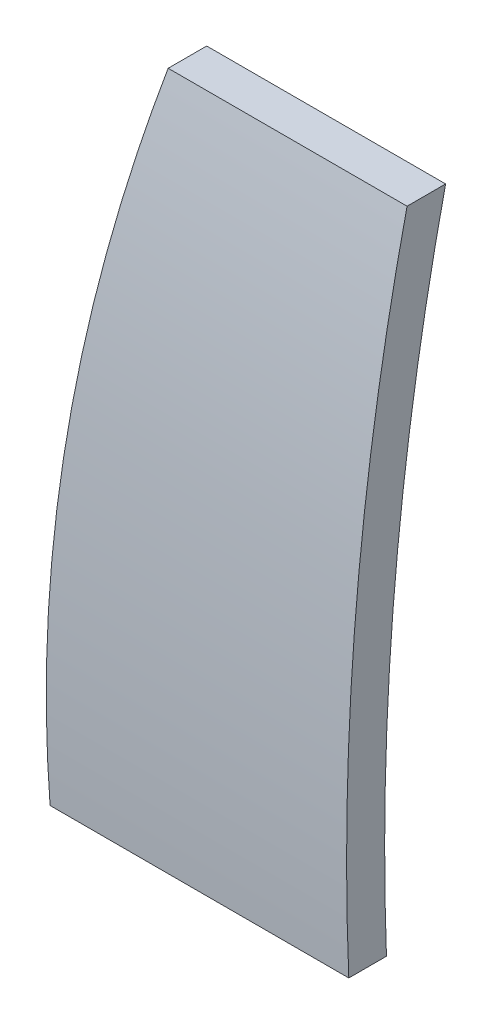
ISO-10303-21;
HEADER;
FILE_DESCRIPTION(('STEP AP214'),'2;1');
FILE_NAME('part.step','',(''),(''),'','','');
FILE_SCHEMA(('AUTOMOTIVE_DESIGN { 1 0 10303 214 1 1 1 1 }'));
ENDSEC;
DATA;
#1=APPLICATION_CONTEXT('core data for automotive mechanical design processes');
#2=APPLICATION_PROTOCOL_DEFINITION('international standard','automotive_design',2000,#1);
#3=PRODUCT_CONTEXT('',#1,'mechanical');
#4=PRODUCT('Part','Part','',(#3));
#5=PRODUCT_RELATED_PRODUCT_CATEGORY('part','',(#4));
#6=PRODUCT_DEFINITION_FORMATION('','',#4);
#7=PRODUCT_DEFINITION_CONTEXT('part definition',#1,'design');
#8=PRODUCT_DEFINITION('design','',#6,#7);
#9=PRODUCT_DEFINITION_SHAPE('','',#8);
#10=(LENGTH_UNIT() NAMED_UNIT(*) SI_UNIT(.MILLI.,.METRE.));
#11=(NAMED_UNIT(*) PLANE_ANGLE_UNIT() SI_UNIT($,.RADIAN.));
#12=(NAMED_UNIT(*) SI_UNIT($,.STERADIAN.) SOLID_ANGLE_UNIT());
#13=UNCERTAINTY_MEASURE_WITH_UNIT(LENGTH_MEASURE(1.E-05),#10,'distance_accuracy_value','');
#14=(GEOMETRIC_REPRESENTATION_CONTEXT(3) GLOBAL_UNCERTAINTY_ASSIGNED_CONTEXT((#13)) GLOBAL_UNIT_ASSIGNED_CONTEXT((#10,
#11,#12)) REPRESENTATION_CONTEXT('',''));
#15=CARTESIAN_POINT('',(0.,0.,0.));
#16=DIRECTION('',(0.,0.,1.));
#17=DIRECTION('',(1.,0.,0.));
#18=AXIS2_PLACEMENT_3D('',#15,#16,#17);
#19=CARTESIAN_POINT('',(5038.22117567225,182.044868634643,254.));
#20=DIRECTION('',(0.,0.,-1.));
#21=DIRECTION('',(-1.,0.,0.));
#22=AXIS2_PLACEMENT_3D('',#19,#20,#21);
#23=CYLINDRICAL_SURFACE('',#22,5041.50899525018);
#24=DIRECTION('',(0.,0.,-1.));
#25=VECTOR('',#24,1.);
#26=CARTESIAN_POINT('',(0.,0.,254.));
#27=LINE('',#26,#25);
#28=CARTESIAN_POINT('',(0.,0.,0.));
#29=VERTEX_POINT('',#28);
#30=CARTESIAN_POINT('',(0.,0.,-76.2671652196312));
#31=VERTEX_POINT('',#30);
#32=EDGE_CURVE('E12',#29,#31,#27,.T.);
#33=ORIENTED_EDGE('',*,*,#32,.F.);
#34=CARTESIAN_POINT('',(0.,-2.22044604925031E-12,4.88498130835069E-11));
#35=CARTESIAN_POINT('',(-0.495845564627125,13.7227835096419,0.58808785706638));
#36=CARTESIAN_POINT('',(-0.935702771868217,27.4499531922245,1.11829142170717));
#37=CARTESIAN_POINT('',(-1.70329831795448,54.9113904696858,2.06279518394046));
#38=CARTESIAN_POINT('',(-2.03103683713763,68.6456580531122,2.47709556795792));
#39=CARTESIAN_POINT('',(-2.84585453321112,109.85622110437,3.54593089337399));
#40=CARTESIAN_POINT('',(-3.16455178123907,137.340717672842,4.0264189025345));
#41=CARTESIAN_POINT('',(-3.35228986558445,192.314890799287,4.5226668656619));
#42=CARTESIAN_POINT('',(-3.22133974556279,219.804567241959,4.53843616635519));
#43=CARTESIAN_POINT('',(-2.68776899417146,261.031347552261,4.21367122504055));
#44=CARTESIAN_POINT('',(-2.4537198476314,274.772362980491,4.04734532895721));
#45=CARTESIAN_POINT('',(-1.87331034255193,302.250399127112,3.59863161012955));
#46=CARTESIAN_POINT('',(-1.52694776473749,315.987419761199,3.3162414939664));
#47=CARTESIAN_POINT('',(-0.32631064835856,356.958003236578,2.30085452199593));
#48=CARTESIAN_POINT('',(0.692531093439545,384.182868907971,1.39779615223563));
#49=CARTESIAN_POINT('',(3.17029819049223,438.593655308562,-0.86311257581185));
#50=CARTESIAN_POINT('',(4.62922364603956,465.779576028884,-2.22096303774376));
#51=CARTESIAN_POINT('',(7.14620622725763,506.517869597251,-4.59734489547152));
#52=CARTESIAN_POINT('',(8.03997465920217,520.090645141939,-5.44608139634906));
#53=CARTESIAN_POINT('',(9.9367333431463,547.220748832745,-7.2564441119113));
#54=CARTESIAN_POINT('',(10.9397214200686,560.778077281054,-8.21806807850493));
#55=CARTESIAN_POINT('',(14.1120870243216,601.424807070752,-11.2718370031707));
#56=CARTESIAN_POINT('',(16.4448773655739,628.489137937373,-13.5328897880368));
#57=CARTESIAN_POINT('',(21.5428688311587,682.532981893333,-18.5020500456652));
#58=CARTESIAN_POINT('',(24.3080285890406,709.512502845126,-21.2101147524499));
#59=CARTESIAN_POINT('',(30.2673616940583,763.375868775677,-27.0698767062546));
#60=CARTESIAN_POINT('',(33.4615351137986,790.259713738242,-30.221574028353));
#61=CARTESIAN_POINT('',(40.2748799702462,843.918898159492,-36.9645747939757));
#62=CARTESIAN_POINT('',(43.894062867876,870.694234671955,-40.5558900924702));
#63=CARTESIAN_POINT('',(51.5527576024811,924.122593773104,-48.1734544029933));
#64=CARTESIAN_POINT('',(55.5922692117021,950.775616428056,-52.1997031793544));
#65=CARTESIAN_POINT('',(64.1226344128669,1004.17249945306,-60.7180975363217));
#66=CARTESIAN_POINT('',(68.6170294324559,1030.91520921864,-65.2139090981264));
#67=CARTESIAN_POINT('',(78.0225363895706,1084.25089342827,-74.6371105805355));
#68=CARTESIAN_POINT('',(82.9336499709985,1110.84386728118,-79.5645022036713));
#69=CARTESIAN_POINT('',(93.1662208475183,1163.8663359792,-89.8445033443412));
#70=CARTESIAN_POINT('',(98.4876484520556,1190.29584250369,-95.1970820959398));
#71=CARTESIAN_POINT('',(106.772782180451,1229.80954563825,-103.540112778654));
#72=CARTESIAN_POINT('',(109.584997770869,1242.9590454181,-106.373489110248));
#73=CARTESIAN_POINT('',(115.309619961026,1269.21333670129,-112.144160054159));
#74=CARTESIAN_POINT('',(118.222026404955,1282.31812827414,-115.081454504868));
#75=CARTESIAN_POINT('',(121.184130799503,1295.39999999999,-118.070312500047));
#76=B_SPLINE_CURVE_WITH_KNOTS('',3,(#34,#35,#36,#37,#38,#39,#40,#41,#42,#43,#44,#45,#46,#47,#48,
#49,#50,#51,#52,#53,#54,#55,#56,#57,#58,#59,#60,#61,#62,#63,#64,#65,#66,#67,#68,#69,#70,#71,#72,
#73,#74,#75),.UNSPECIFIED.,.F.,.F.,(4,2,2,2,2,2,2,2,2,2,2,2,2,2,2,2,2,2,2,2,4),(0.,
41.2325060316328,82.4649457422801,164.928501022691,247.390397741049,288.621612531322,
329.853642085961,411.622451367861,493.391279284455,534.276350551089,575.160607752359,
656.928565045871,738.688704064645,820.448856920157,902.21121504896,983.973528875254,
1066.43015483921,1148.88710609932,1231.33809631719,1272.56374798094,1313.78933553597),.UNSPECIFIED.);
#77=CARTESIAN_POINT('',(121.184130799503,1295.4,-118.0703125));
#78=VERTEX_POINT('',#77);
#79=EDGE_CURVE('E122',#29,#78,#76,.T.);
#80=ORIENTED_EDGE('',*,*,#79,.T.);
#81=DIRECTION('',(0.,0.,-1.));
#82=VECTOR('',#81,1.);
#83=CARTESIAN_POINT('',(121.184130799503,1295.39999999999,254.));
#84=LINE('',#83,#82);
#85=CARTESIAN_POINT('',(121.184130799503,1295.39999999999,-196.186778864413));
#86=VERTEX_POINT('',#85);
#87=EDGE_CURVE('E139',#78,#86,#84,.T.);
#88=ORIENTED_EDGE('',*,*,#87,.T.);
#89=CARTESIAN_POINT('',(0.,-2.22044604925031E-12,-76.2671652196314));
#90=CARTESIAN_POINT('',(-0.495877298153793,13.7236662682151,-75.7454037839634));
#91=CARTESIAN_POINT('',(-0.935747371032224,27.4513864684142,-75.280053932986));
#92=CARTESIAN_POINT('',(-1.70334722840966,54.9133026022606,-74.4623011920412));
#93=CARTESIAN_POINT('',(-2.03107719094918,68.6474985255919,-74.1098981227526));
#94=CARTESIAN_POINT('',(-2.84586168295182,109.856983667203,-73.2223018926672));
#95=CARTESIAN_POINT('',(-3.16452647037576,137.33960336273,-72.8567052395197));
#96=CARTESIAN_POINT('',(-3.35228825512536,192.308122942749,-72.5782878096096));
#97=CARTESIAN_POINT('',(-3.22139425303611,219.794022750553,-72.6654579680523));
#98=CARTESIAN_POINT('',(-2.68803406098716,261.014031077985,-73.1356296963342));
#99=CARTESIAN_POINT('',(-2.45407618802117,274.752603882813,-73.3489242365462));
#100=CARTESIAN_POINT('',(-1.87389881846602,302.225423612498,-73.8885719422799));
#101=CARTESIAN_POINT('',(-1.52767716167026,315.959670449024,-74.2149272833528));
#102=CARTESIAN_POINT('',(-0.32736827128105,356.927574663528,-75.3571506395383));
#103=CARTESIAN_POINT('',(0.691301006646273,384.152120129974,-76.3387683287316));
#104=CARTESIAN_POINT('',(3.16866712979857,438.561570112355,-78.7451537884329));
#105=CARTESIAN_POINT('',(4.62736407892119,465.746474618928,-80.1699216635758));
#106=CARTESIAN_POINT('',(7.14396108684314,506.483030278423,-82.6379605849831));
#107=CARTESIAN_POINT('',(8.03759386240268,520.055190979329,-83.5157964681173));
#108=CARTESIAN_POINT('',(9.93406943974972,547.184042874318,-85.3814558434823));
#109=CARTESIAN_POINT('',(10.9369101230733,560.740734363326,-86.3692772021739));
#110=CARTESIAN_POINT('',(14.1088191901106,601.385576269493,-89.4972924803694));
#111=CARTESIAN_POINT('',(16.4412857213696,628.448674211626,-91.8020485178918));
#112=CARTESIAN_POINT('',(21.5386450652865,682.490590598169,-96.8470871063757));
#113=CARTESIAN_POINT('',(24.3034977992547,709.469416617733,-99.5873292916889));
#114=CARTESIAN_POINT('',(30.2622952708094,763.332207240327,-105.499995931989));
#115=CARTESIAN_POINT('',(33.4562400780605,790.216171827954,-108.672420457142));
#116=CARTESIAN_POINT('',(40.2692929724302,843.876734639422,-115.445516959809));
#117=CARTESIAN_POINT('',(43.8884120074492,870.653330080226,-119.046199964671));
#118=CARTESIAN_POINT('',(51.5472596707448,924.085720336931,-126.671255714952));
#119=CARTESIAN_POINT('',(55.5869880788212,950.741515216068,-130.695628238558));
#120=CARTESIAN_POINT('',(64.1172580476437,1004.13989615516,-139.198148696264));
#121=CARTESIAN_POINT('',(68.6112513133629,1030.88137712413,-143.679773881506));
#122=CARTESIAN_POINT('',(78.016345833087,1084.21685357535,-153.06325734312));
#123=CARTESIAN_POINT('',(82.9274486628205,1110.81084850003,-157.965117207028));
#124=CARTESIAN_POINT('',(93.1605786852685,1163.83798392849,-168.182885777828));
#125=CARTESIAN_POINT('',(98.4825772968615,1190.27113548249,-173.498765686507));
#126=CARTESIAN_POINT('',(106.769143427457,1229.79245207826,-181.778496721651));
#127=CARTESIAN_POINT('',(109.581932582551,1242.94484784086,-184.589398003361));
#128=CARTESIAN_POINT('',(115.307918663472,1269.20567407987,-190.312389497767));
#129=CARTESIAN_POINT('',(118.221115439467,1282.31410462185,-193.224479559467));
#130=CARTESIAN_POINT('',(121.184130799504,1295.4,-196.186778864413));
#131=B_SPLINE_CURVE_WITH_KNOTS('',3,(#89,#90,#91,#92,#93,#94,#95,#96,#97,#98,#99,#100,#101,#102,
#103,#104,#105,#106,#107,#108,#109,#110,#111,#112,#113,#114,#115,#116,#117,#118,#119,#120,#121,
#122,#123,#124,#125,#126,#127,#128,#129,#130),.UNSPECIFIED.,.F.,.F.,(4,2,2,2,2,2,2,2,2,2,2,2,2,
2,2,2,2,2,2,2,4),(0.,41.2271316918527,82.4541979286819,164.907029619227,247.358210537021,
288.584062703643,329.810708195058,411.58688987114,493.363090855914,534.251849096193,
575.139814299262,656.915202555361,738.683015384809,820.450841489581,902.220773512959,
983.990662727838,1066.43673972419,1148.88312819367,1231.32378700845,1272.54427611306,
1313.7647037098),.UNSPECIFIED.);
#132=EDGE_CURVE('E103',#31,#86,#131,.T.);
#133=ORIENTED_EDGE('',*,*,#132,.F.);
#134=EDGE_LOOP('',(#33,#80,#88,#133));
#135=FACE_BOUND('',#134,.T.);
#136=ADVANCED_FACE('F80',(#135),#23,.T.);
#137=CARTESIAN_POINT('',(0.,0.,254.));
#138=DIRECTION('',(0.,1.,0.));
#139=DIRECTION('',(0.,0.,1.));
#140=AXIS2_PLACEMENT_3D('',#137,#138,#139);
#141=PLANE('',#140);
#142=DIRECTION('',(0.,0.,-1.));
#143=VECTOR('',#142,1.);
#144=CARTESIAN_POINT('',(605.308130799503,0.,254.));
#145=LINE('',#144,#143);
#146=CARTESIAN_POINT('',(605.308130799503,0.,0.));
#147=VERTEX_POINT('',#146);
#148=CARTESIAN_POINT('',(605.308130799503,0.,-76.2671652196312));
#149=VERTEX_POINT('',#148);
#150=EDGE_CURVE('E88',#147,#149,#145,.T.);
#151=ORIENTED_EDGE('',*,*,#150,.F.);
#152=DIRECTION('',(-1.,0.,0.));
#153=VECTOR('',#152,1.);
#154=CARTESIAN_POINT('',(605.308130799503,0.,0.));
#155=LINE('',#154,#153);
#156=EDGE_CURVE('E120',#147,#29,#155,.T.);
#157=ORIENTED_EDGE('',*,*,#156,.T.);
#158=ORIENTED_EDGE('',*,*,#32,.T.);
#159=DIRECTION('',(-1.,0.,0.));
#160=VECTOR('',#159,1.);
#161=CARTESIAN_POINT('',(605.308130799503,0.,-76.2671652196312));
#162=LINE('',#161,#160);
#163=EDGE_CURVE('E138',#149,#31,#162,.T.);
#164=ORIENTED_EDGE('',*,*,#163,.F.);
#165=EDGE_LOOP('',(#151,#157,#158,#164));
#166=FACE_BOUND('',#165,.T.);
#167=ADVANCED_FACE('F137',(#166),#141,.F.);
#168=CARTESIAN_POINT('',(605.308130799503,1295.39999999999,254.));
#169=DIRECTION('',(-1.,0.,0.));
#170=DIRECTION('',(0.,-1.,0.));
#171=AXIS2_PLACEMENT_3D('',#168,#169,#170);
#172=PLANE('',#171);
#173=DIRECTION('',(0.,0.,-1.));
#174=VECTOR('',#173,1.);
#175=CARTESIAN_POINT('',(605.308130799503,1295.39999999999,254.));
#176=LINE('',#175,#174);
#177=CARTESIAN_POINT('',(605.308130799503,1295.39999999999,-118.0703125));
#178=VERTEX_POINT('',#177);
#179=CARTESIAN_POINT('',(605.308130799503,1295.4,-196.186778864413));
#180=VERTEX_POINT('',#179);
#181=EDGE_CURVE('E134',#178,#180,#176,.T.);
#182=ORIENTED_EDGE('',*,*,#181,.F.);
#183=CARTESIAN_POINT('',(605.308130799503,208.861419048448,-4873.72130154307));
#184=DIRECTION('',(1.,0.,0.));
#185=DIRECTION('',(0.,0.,-1.));
#186=AXIS2_PLACEMENT_3D('',#183,#184,#185);
#187=CIRCLE('',#186,4878.19458585674);
#188=EDGE_CURVE('E95',#178,#147,#187,.T.);
#189=ORIENTED_EDGE('',*,*,#188,.T.);
#190=ORIENTED_EDGE('',*,*,#150,.T.);
#191=CARTESIAN_POINT('',(605.308130799503,190.178521981645,-5078.48207620329));
#192=DIRECTION('',(1.,0.,0.));
#193=DIRECTION('',(0.,0.,-1.));
#194=AXIS2_PLACEMENT_3D('',#191,#192,#193);
#195=CIRCLE('',#194,5005.82879110846);
#196=EDGE_CURVE('E174',#180,#149,#195,.T.);
#197=ORIENTED_EDGE('',*,*,#196,.F.);
#198=EDGE_LOOP('',(#182,#189,#190,#197));
#199=FACE_BOUND('',#198,.T.);
#200=ADVANCED_FACE('F131',(#199),#172,.F.);
#201=CARTESIAN_POINT('',(121.184130799503,1295.39999999999,254.));
#202=DIRECTION('',(0.,-1.,0.));
#203=DIRECTION('',(0.,0.,-1.));
#204=AXIS2_PLACEMENT_3D('',#201,#202,#203);
#205=PLANE('',#204);
#206=ORIENTED_EDGE('',*,*,#87,.F.);
#207=DIRECTION('',(-1.,0.,0.));
#208=VECTOR('',#207,1.);
#209=CARTESIAN_POINT('',(605.308130799503,1295.4,-118.0703125));
#210=LINE('',#209,#208);
#211=EDGE_CURVE('E126',#178,#78,#210,.T.);
#212=ORIENTED_EDGE('',*,*,#211,.F.);
#213=ORIENTED_EDGE('',*,*,#181,.T.);
#214=DIRECTION('',(-1.,0.,0.));
#215=VECTOR('',#214,1.);
#216=CARTESIAN_POINT('',(605.308130799503,1295.4,-196.186778864413));
#217=LINE('',#216,#215);
#218=EDGE_CURVE('E173',#180,#86,#217,.T.);
#219=ORIENTED_EDGE('',*,*,#218,.T.);
#220=EDGE_LOOP('',(#206,#212,#213,#219));
#221=FACE_BOUND('',#220,.T.);
#222=ADVANCED_FACE('F160',(#221),#205,.F.);
#223=CARTESIAN_POINT('',(605.308130799503,190.178521981645,-5078.48207620329));
#224=DIRECTION('',(-1.,0.,0.));
#225=DIRECTION('',(0.,0.,1.));
#226=AXIS2_PLACEMENT_3D('',#223,#224,#225);
#227=CYLINDRICAL_SURFACE('',#226,5005.82879110846);
#228=ORIENTED_EDGE('',*,*,#132,.T.);
#229=ORIENTED_EDGE('',*,*,#218,.F.);
#230=ORIENTED_EDGE('',*,*,#196,.T.);
#231=ORIENTED_EDGE('',*,*,#163,.T.);
#232=EDGE_LOOP('',(#228,#229,#230,#231));
#233=FACE_BOUND('',#232,.T.);
#234=ADVANCED_FACE('F156',(#233),#227,.F.);
#235=CARTESIAN_POINT('',(605.308130799503,208.861419048448,-4873.72130154307));
#236=DIRECTION('',(-1.,0.,0.));
#237=DIRECTION('',(0.,0.,1.));
#238=AXIS2_PLACEMENT_3D('',#235,#236,#237);
#239=CYLINDRICAL_SURFACE('',#238,4878.19458585674);
#240=ORIENTED_EDGE('',*,*,#156,.F.);
#241=ORIENTED_EDGE('',*,*,#188,.F.);
#242=ORIENTED_EDGE('',*,*,#211,.T.);
#243=ORIENTED_EDGE('',*,*,#79,.F.);
#244=EDGE_LOOP('',(#240,#241,#242,#243));
#245=FACE_BOUND('',#244,.T.);
#246=ADVANCED_FACE('F121',(#245),#239,.T.);
#247=CLOSED_SHELL('',(#136,#167,#200,#222,#234,#246));
#248=MANIFOLD_SOLID_BREP('B2',#247);
#249=ADVANCED_BREP_SHAPE_REPRESENTATION('',(#18,#248),#14);
#250=SHAPE_DEFINITION_REPRESENTATION(#9,#249);
ENDSEC;
END-ISO-10303-21;
